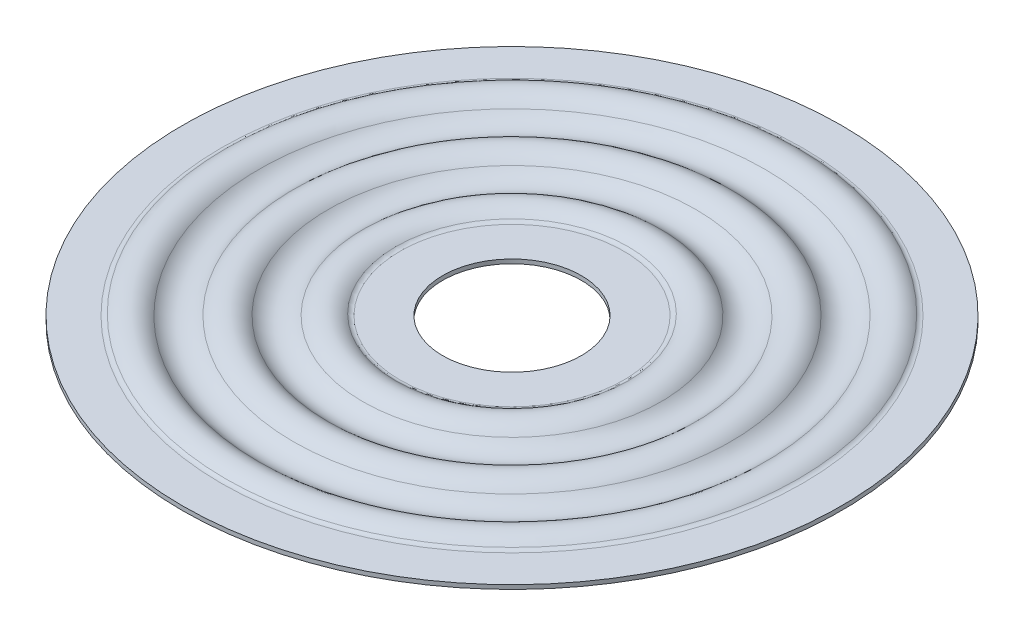
ISO-10303-21;
HEADER;
FILE_DESCRIPTION(('STEP AP214'),'2;1');
FILE_NAME('part.step','',(''),(''),'','','');
FILE_SCHEMA(('AUTOMOTIVE_DESIGN { 1 0 10303 214 1 1 1 1 }'));
ENDSEC;
DATA;
#1=APPLICATION_CONTEXT('core data for automotive mechanical design processes');
#2=APPLICATION_PROTOCOL_DEFINITION('international standard','automotive_design',2000,#1);
#3=PRODUCT_CONTEXT('',#1,'mechanical');
#4=PRODUCT('Part','Part','',(#3));
#5=PRODUCT_RELATED_PRODUCT_CATEGORY('part','',(#4));
#6=PRODUCT_DEFINITION_FORMATION('','',#4);
#7=PRODUCT_DEFINITION_CONTEXT('part definition',#1,'design');
#8=PRODUCT_DEFINITION('design','',#6,#7);
#9=PRODUCT_DEFINITION_SHAPE('','',#8);
#10=(LENGTH_UNIT() NAMED_UNIT(*) SI_UNIT(.MILLI.,.METRE.));
#11=(NAMED_UNIT(*) PLANE_ANGLE_UNIT() SI_UNIT($,.RADIAN.));
#12=(NAMED_UNIT(*) SI_UNIT($,.STERADIAN.) SOLID_ANGLE_UNIT());
#13=UNCERTAINTY_MEASURE_WITH_UNIT(LENGTH_MEASURE(1.E-05),#10,'distance_accuracy_value','');
#14=(GEOMETRIC_REPRESENTATION_CONTEXT(3) GLOBAL_UNCERTAINTY_ASSIGNED_CONTEXT((#13)) GLOBAL_UNIT_ASSIGNED_CONTEXT((#10,
#11,#12)) REPRESENTATION_CONTEXT('',''));
#15=CARTESIAN_POINT('',(0.,0.,0.));
#16=DIRECTION('',(0.,0.,1.));
#17=DIRECTION('',(1.,0.,0.));
#18=AXIS2_PLACEMENT_3D('',#15,#16,#17);
#19=CARTESIAN_POINT('',(0.,10.,0.));
#20=DIRECTION('',(0.,1.,0.));
#21=DIRECTION('',(0.,0.,1.));
#22=AXIS2_PLACEMENT_3D('',#19,#20,#21);
#23=CYLINDRICAL_SURFACE('',#22,47.5);
#24=CARTESIAN_POINT('',(0.,10.,0.));
#25=DIRECTION('',(0.,1.,0.));
#26=DIRECTION('',(0.,0.,1.));
#27=AXIS2_PLACEMENT_3D('',#24,#25,#26);
#28=CIRCLE('',#27,47.5);
#29=CARTESIAN_POINT('',(0.,10.,47.5));
#30=VERTEX_POINT('',#29);
#31=EDGE_CURVE('E54',#30,#30,#28,.T.);
#32=ORIENTED_EDGE('',*,*,#31,.F.);
#33=EDGE_LOOP('',(#32));
#34=FACE_BOUND('',#33,.T.);
#35=CARTESIAN_POINT('',(0.,9.4,0.));
#36=DIRECTION('',(0.,1.,0.));
#37=DIRECTION('',(0.,0.,1.));
#38=AXIS2_PLACEMENT_3D('',#35,#36,#37);
#39=CIRCLE('',#38,47.5);
#40=CARTESIAN_POINT('',(0.,9.4,47.5));
#41=VERTEX_POINT('',#40);
#42=EDGE_CURVE('E77',#41,#41,#39,.T.);
#43=ORIENTED_EDGE('',*,*,#42,.T.);
#44=EDGE_LOOP('',(#43));
#45=FACE_BOUND('',#44,.T.);
#46=ADVANCED_FACE('F34',(#34,#45),#23,.T.);
#47=CARTESIAN_POINT('',(-47.5,10.,0.));
#48=DIRECTION('',(0.,1.,0.));
#49=DIRECTION('',(0.,0.,1.));
#50=AXIS2_PLACEMENT_3D('',#47,#48,#49);
#51=PLANE('',#50);
#52=CARTESIAN_POINT('',(0.,10.,0.));
#53=DIRECTION('',(0.,1.,0.));
#54=DIRECTION('',(0.,0.,1.));
#55=AXIS2_PLACEMENT_3D('',#52,#53,#54);
#56=CIRCLE('',#55,41.8898132317563);
#57=CARTESIAN_POINT('',(0.,10.,41.8898132317563));
#58=VERTEX_POINT('',#57);
#59=EDGE_CURVE('E10',#58,#58,#56,.F.);
#60=ORIENTED_EDGE('',*,*,#59,.T.);
#61=EDGE_LOOP('',(#60));
#62=FACE_BOUND('',#61,.T.);
#63=ORIENTED_EDGE('',*,*,#31,.T.);
#64=EDGE_LOOP('',(#63));
#65=FACE_BOUND('',#64,.T.);
#66=ADVANCED_FACE('F114',(#62,#65),#51,.T.);
#67=CARTESIAN_POINT('',(0.,7.55051025721682,0.));
#68=DIRECTION('',(0.,1.,0.));
#69=DIRECTION('',(0.,0.,1.));
#70=AXIS2_PLACEMENT_3D('',#67,#68,#69);
#71=TOROIDAL_SURFACE('',#70,39.,3.5);
#72=CARTESIAN_POINT('',(0.,10.233446723826,0.));
#73=DIRECTION('',(0.,-1.,0.));
#74=DIRECTION('',(0.,0.,-1.));
#75=AXIS2_PLACEMENT_3D('',#72,#73,#74);
#76=CIRCLE('',#75,41.2476325135882);
#77=CARTESIAN_POINT('',(0.,10.233446723826,-41.2476325135882));
#78=VERTEX_POINT('',#77);
#79=EDGE_CURVE('E41',#78,#78,#76,.F.);
#80=ORIENTED_EDGE('',*,*,#79,.T.);
#81=EDGE_LOOP('',(#80));
#82=FACE_BOUND('',#81,.T.);
#83=CARTESIAN_POINT('',(0.,10.,0.));
#84=DIRECTION('',(0.,1.,0.));
#85=DIRECTION('',(0.,0.,1.));
#86=AXIS2_PLACEMENT_3D('',#83,#84,#85);
#87=CIRCLE('',#86,36.5);
#88=CARTESIAN_POINT('',(0.,10.,36.5));
#89=VERTEX_POINT('',#88);
#90=EDGE_CURVE('E57',#89,#89,#87,.T.);
#91=ORIENTED_EDGE('',*,*,#90,.F.);
#92=EDGE_LOOP('',(#91));
#93=FACE_BOUND('',#92,.T.);
#94=ADVANCED_FACE('F120',(#82,#93),#71,.T.);
#95=CARTESIAN_POINT('',(0.,12.4494897427832,0.));
#96=DIRECTION('',(0.,1.,0.));
#97=DIRECTION('',(0.,0.,1.));
#98=AXIS2_PLACEMENT_3D('',#95,#96,#97);
#99=TOROIDAL_SURFACE('',#98,34.,3.5);
#100=ORIENTED_EDGE('',*,*,#90,.T.);
#101=EDGE_LOOP('',(#100));
#102=FACE_BOUND('',#101,.T.);
#103=CARTESIAN_POINT('',(0.,10.,0.));
#104=DIRECTION('',(0.,1.,0.));
#105=DIRECTION('',(0.,0.,1.));
#106=AXIS2_PLACEMENT_3D('',#103,#104,#105);
#107=CIRCLE('',#106,31.5);
#108=CARTESIAN_POINT('',(0.,10.,31.5));
#109=VERTEX_POINT('',#108);
#110=EDGE_CURVE('E60',#109,#109,#107,.T.);
#111=ORIENTED_EDGE('',*,*,#110,.F.);
#112=EDGE_LOOP('',(#111));
#113=FACE_BOUND('',#112,.T.);
#114=ADVANCED_FACE('F160',(#102,#113),#99,.F.);
#115=CARTESIAN_POINT('',(0.,7.55051025721682,0.));
#116=DIRECTION('',(0.,1.,0.));
#117=DIRECTION('',(0.,0.,1.));
#118=AXIS2_PLACEMENT_3D('',#115,#116,#117);
#119=TOROIDAL_SURFACE('',#118,29.,3.5);
#120=ORIENTED_EDGE('',*,*,#110,.T.);
#121=EDGE_LOOP('',(#120));
#122=FACE_BOUND('',#121,.T.);
#123=CARTESIAN_POINT('',(0.,10.,0.));
#124=DIRECTION('',(0.,1.,0.));
#125=DIRECTION('',(0.,0.,1.));
#126=AXIS2_PLACEMENT_3D('',#123,#124,#125);
#127=CIRCLE('',#126,26.5);
#128=CARTESIAN_POINT('',(0.,10.,26.5));
#129=VERTEX_POINT('',#128);
#130=EDGE_CURVE('E63',#129,#129,#127,.T.);
#131=ORIENTED_EDGE('',*,*,#130,.F.);
#132=EDGE_LOOP('',(#131));
#133=FACE_BOUND('',#132,.T.);
#134=ADVANCED_FACE('F156',(#122,#133),#119,.T.);
#135=CARTESIAN_POINT('',(0.,12.4494897427832,0.));
#136=DIRECTION('',(0.,1.,0.));
#137=DIRECTION('',(0.,0.,1.));
#138=AXIS2_PLACEMENT_3D('',#135,#136,#137);
#139=TOROIDAL_SURFACE('',#138,24.,3.5);
#140=ORIENTED_EDGE('',*,*,#130,.T.);
#141=EDGE_LOOP('',(#140));
#142=FACE_BOUND('',#141,.T.);
#143=CARTESIAN_POINT('',(0.,10.,0.));
#144=DIRECTION('',(0.,1.,0.));
#145=DIRECTION('',(0.,0.,1.));
#146=AXIS2_PLACEMENT_3D('',#143,#144,#145);
#147=CIRCLE('',#146,21.5);
#148=CARTESIAN_POINT('',(0.,10.,21.5));
#149=VERTEX_POINT('',#148);
#150=EDGE_CURVE('E66',#149,#149,#147,.T.);
#151=ORIENTED_EDGE('',*,*,#150,.F.);
#152=EDGE_LOOP('',(#151));
#153=FACE_BOUND('',#152,.T.);
#154=ADVANCED_FACE('F149',(#142,#153),#139,.F.);
#155=CARTESIAN_POINT('',(0.,7.55051025721682,0.));
#156=DIRECTION('',(0.,1.,0.));
#157=DIRECTION('',(0.,0.,1.));
#158=AXIS2_PLACEMENT_3D('',#155,#156,#157);
#159=TOROIDAL_SURFACE('',#158,19.,3.5);
#160=CARTESIAN_POINT('',(0.,10.233446723826,0.));
#161=DIRECTION('',(0.,-1.,0.));
#162=DIRECTION('',(0.,0.,-1.));
#163=AXIS2_PLACEMENT_3D('',#160,#161,#162);
#164=CIRCLE('',#163,16.7523674864118);
#165=CARTESIAN_POINT('',(0.,10.233446723826,-16.7523674864118));
#166=VERTEX_POINT('',#165);
#167=EDGE_CURVE('E45',#166,#166,#164,.T.);
#168=ORIENTED_EDGE('',*,*,#167,.T.);
#169=EDGE_LOOP('',(#168));
#170=FACE_BOUND('',#169,.T.);
#171=ORIENTED_EDGE('',*,*,#150,.T.);
#172=EDGE_LOOP('',(#171));
#173=FACE_BOUND('',#172,.T.);
#174=ADVANCED_FACE('F142',(#170,#173),#159,.T.);
#175=CARTESIAN_POINT('',(-16.5,10.,0.));
#176=DIRECTION('',(0.,1.,0.));
#177=DIRECTION('',(0.,0.,1.));
#178=AXIS2_PLACEMENT_3D('',#175,#176,#177);
#179=PLANE('',#178);
#180=CARTESIAN_POINT('',(0.,10.,0.));
#181=DIRECTION('',(0.,1.,0.));
#182=DIRECTION('',(0.,0.,1.));
#183=AXIS2_PLACEMENT_3D('',#180,#181,#182);
#184=CIRCLE('',#183,16.1101867682437);
#185=CARTESIAN_POINT('',(0.,10.,16.1101867682437));
#186=VERTEX_POINT('',#185);
#187=EDGE_CURVE('E49',#186,#186,#184,.T.);
#188=ORIENTED_EDGE('',*,*,#187,.T.);
#189=EDGE_LOOP('',(#188));
#190=FACE_BOUND('',#189,.T.);
#191=CARTESIAN_POINT('',(0.,10.,0.));
#192=DIRECTION('',(0.,1.,0.));
#193=DIRECTION('',(0.,0.,1.));
#194=AXIS2_PLACEMENT_3D('',#191,#192,#193);
#195=CIRCLE('',#194,10.);
#196=CARTESIAN_POINT('',(0.,10.,10.));
#197=VERTEX_POINT('',#196);
#198=EDGE_CURVE('E69',#197,#197,#195,.T.);
#199=ORIENTED_EDGE('',*,*,#198,.F.);
#200=EDGE_LOOP('',(#199));
#201=FACE_BOUND('',#200,.T.);
#202=ADVANCED_FACE('F133',(#190,#201),#179,.T.);
#203=CARTESIAN_POINT('',(0.,10.,0.));
#204=DIRECTION('',(0.,1.,0.));
#205=DIRECTION('',(0.,0.,1.));
#206=AXIS2_PLACEMENT_3D('',#203,#204,#205);
#207=CYLINDRICAL_SURFACE('',#206,10.);
#208=CARTESIAN_POINT('',(0.,9.4,0.));
#209=DIRECTION('',(0.,1.,0.));
#210=DIRECTION('',(0.,0.,1.));
#211=AXIS2_PLACEMENT_3D('',#208,#209,#210);
#212=CIRCLE('',#211,10.);
#213=CARTESIAN_POINT('',(0.,9.4,10.));
#214=VERTEX_POINT('',#213);
#215=EDGE_CURVE('E73',#214,#214,#212,.T.);
#216=ORIENTED_EDGE('',*,*,#215,.F.);
#217=EDGE_LOOP('',(#216));
#218=FACE_BOUND('',#217,.T.);
#219=ORIENTED_EDGE('',*,*,#198,.T.);
#220=EDGE_LOOP('',(#219));
#221=FACE_BOUND('',#220,.T.);
#222=ADVANCED_FACE('F126',(#218,#221),#207,.F.);
#223=CARTESIAN_POINT('',(0.,11.,0.));
#224=DIRECTION('',(0.,-1.,0.));
#225=DIRECTION('',(0.,0.,-1.));
#226=AXIS2_PLACEMENT_3D('',#223,#224,#225);
#227=TOROIDAL_SURFACE('',#226,16.1101867682437,1.);
#228=ORIENTED_EDGE('',*,*,#167,.F.);
#229=EDGE_LOOP('',(#228));
#230=FACE_BOUND('',#229,.T.);
#231=ORIENTED_EDGE('',*,*,#187,.F.);
#232=EDGE_LOOP('',(#231));
#233=FACE_BOUND('',#232,.T.);
#234=ADVANCED_FACE('F124',(#230,#233),#227,.F.);
#235=CARTESIAN_POINT('',(0.,11.,0.));
#236=DIRECTION('',(0.,1.,0.));
#237=DIRECTION('',(0.,0.,1.));
#238=AXIS2_PLACEMENT_3D('',#235,#236,#237);
#239=TOROIDAL_SURFACE('',#238,41.8898132317563,1.);
#240=ORIENTED_EDGE('',*,*,#59,.F.);
#241=EDGE_LOOP('',(#240));
#242=FACE_BOUND('',#241,.T.);
#243=ORIENTED_EDGE('',*,*,#79,.F.);
#244=EDGE_LOOP('',(#243));
#245=FACE_BOUND('',#244,.T.);
#246=ADVANCED_FACE('F36',(#242,#245),#239,.F.);
#247=CARTESIAN_POINT('',(-47.5,9.4,0.));
#248=DIRECTION('',(0.,1.,0.));
#249=DIRECTION('',(0.,0.,1.));
#250=AXIS2_PLACEMENT_3D('',#247,#248,#249);
#251=PLANE('',#250);
#252=CARTESIAN_POINT('',(0.,9.4,0.));
#253=DIRECTION('',(0.,1.,0.));
#254=DIRECTION('',(0.,0.,1.));
#255=AXIS2_PLACEMENT_3D('',#252,#253,#254);
#256=CIRCLE('',#255,41.8898132317563);
#257=CARTESIAN_POINT('',(0.,9.4,41.8898132317563));
#258=VERTEX_POINT('',#257);
#259=EDGE_CURVE('E72',#258,#258,#256,.F.);
#260=ORIENTED_EDGE('',*,*,#259,.F.);
#261=EDGE_LOOP('',(#260));
#262=FACE_BOUND('',#261,.T.);
#263=ORIENTED_EDGE('',*,*,#42,.F.);
#264=EDGE_LOOP('',(#263));
#265=FACE_BOUND('',#264,.T.);
#266=ADVANCED_FACE('F106',(#262,#265),#251,.F.);
#267=CARTESIAN_POINT('',(0.,7.55051025721682,0.));
#268=DIRECTION('',(0.,1.,0.));
#269=DIRECTION('',(0.,0.,1.));
#270=AXIS2_PLACEMENT_3D('',#267,#268,#269);
#271=TOROIDAL_SURFACE('',#270,39.,2.9);
#272=CARTESIAN_POINT('',(0.,9.77351475812154,0.));
#273=DIRECTION('',(0.,1.,0.));
#274=DIRECTION('',(0.,0.,1.));
#275=AXIS2_PLACEMENT_3D('',#272,#273,#274);
#276=CIRCLE('',#275,40.8623240826874);
#277=CARTESIAN_POINT('',(0.,9.77351475812154,40.8623240826874));
#278=VERTEX_POINT('',#277);
#279=EDGE_CURVE('E87',#278,#278,#276,.T.);
#280=ORIENTED_EDGE('',*,*,#279,.F.);
#281=EDGE_LOOP('',(#280));
#282=FACE_BOUND('',#281,.T.);
#283=CARTESIAN_POINT('',(0.,9.58008747266574,0.));
#284=DIRECTION('',(0.,1.,0.));
#285=DIRECTION('',(0.,0.,1.));
#286=AXIS2_PLACEMENT_3D('',#283,#284,#285);
#287=CIRCLE('',#286,36.9285714285714);
#288=CARTESIAN_POINT('',(0.,9.58008747266574,36.9285714285714));
#289=VERTEX_POINT('',#288);
#290=EDGE_CURVE('E81',#289,#289,#287,.T.);
#291=ORIENTED_EDGE('',*,*,#290,.T.);
#292=EDGE_LOOP('',(#291));
#293=FACE_BOUND('',#292,.T.);
#294=ADVANCED_FACE('F109',(#282,#293),#271,.F.);
#295=CARTESIAN_POINT('',(0.,12.4494897427832,0.));
#296=DIRECTION('',(0.,1.,0.));
#297=DIRECTION('',(0.,0.,1.));
#298=AXIS2_PLACEMENT_3D('',#295,#296,#297);
#299=TOROIDAL_SURFACE('',#298,34.,4.1);
#300=ORIENTED_EDGE('',*,*,#290,.F.);
#301=EDGE_LOOP('',(#300));
#302=FACE_BOUND('',#301,.T.);
#303=CARTESIAN_POINT('',(0.,9.58008747266574,0.));
#304=DIRECTION('',(0.,1.,0.));
#305=DIRECTION('',(0.,0.,1.));
#306=AXIS2_PLACEMENT_3D('',#303,#304,#305);
#307=CIRCLE('',#306,31.0714285714286);
#308=CARTESIAN_POINT('',(0.,9.58008747266574,31.0714285714286));
#309=VERTEX_POINT('',#308);
#310=EDGE_CURVE('E93',#309,#309,#307,.T.);
#311=ORIENTED_EDGE('',*,*,#310,.T.);
#312=EDGE_LOOP('',(#311));
#313=FACE_BOUND('',#312,.T.);
#314=ADVANCED_FACE('F233',(#302,#313),#299,.T.);
#315=CARTESIAN_POINT('',(0.,7.55051025721682,0.));
#316=DIRECTION('',(0.,1.,0.));
#317=DIRECTION('',(0.,0.,1.));
#318=AXIS2_PLACEMENT_3D('',#315,#316,#317);
#319=TOROIDAL_SURFACE('',#318,29.,2.9);
#320=ORIENTED_EDGE('',*,*,#310,.F.);
#321=EDGE_LOOP('',(#320));
#322=FACE_BOUND('',#321,.T.);
#323=CARTESIAN_POINT('',(0.,9.58008747266574,0.));
#324=DIRECTION('',(0.,1.,0.));
#325=DIRECTION('',(0.,0.,1.));
#326=AXIS2_PLACEMENT_3D('',#323,#324,#325);
#327=CIRCLE('',#326,26.9285714285714);
#328=CARTESIAN_POINT('',(0.,9.58008747266574,26.9285714285714));
#329=VERTEX_POINT('',#328);
#330=EDGE_CURVE('E90',#329,#329,#327,.T.);
#331=ORIENTED_EDGE('',*,*,#330,.T.);
#332=EDGE_LOOP('',(#331));
#333=FACE_BOUND('',#332,.T.);
#334=ADVANCED_FACE('F243',(#322,#333),#319,.F.);
#335=CARTESIAN_POINT('',(0.,12.4494897427832,0.));
#336=DIRECTION('',(0.,1.,0.));
#337=DIRECTION('',(0.,0.,1.));
#338=AXIS2_PLACEMENT_3D('',#335,#336,#337);
#339=TOROIDAL_SURFACE('',#338,24.,4.1);
#340=ORIENTED_EDGE('',*,*,#330,.F.);
#341=EDGE_LOOP('',(#340));
#342=FACE_BOUND('',#341,.T.);
#343=CARTESIAN_POINT('',(0.,9.58008747266574,0.));
#344=DIRECTION('',(0.,1.,0.));
#345=DIRECTION('',(0.,0.,1.));
#346=AXIS2_PLACEMENT_3D('',#343,#344,#345);
#347=CIRCLE('',#346,21.0714285714286);
#348=CARTESIAN_POINT('',(0.,9.58008747266574,21.0714285714286));
#349=VERTEX_POINT('',#348);
#350=EDGE_CURVE('E76',#349,#349,#347,.T.);
#351=ORIENTED_EDGE('',*,*,#350,.T.);
#352=EDGE_LOOP('',(#351));
#353=FACE_BOUND('',#352,.T.);
#354=ADVANCED_FACE('F253',(#342,#353),#339,.T.);
#355=CARTESIAN_POINT('',(0.,7.55051025721682,0.));
#356=DIRECTION('',(0.,1.,0.));
#357=DIRECTION('',(0.,0.,1.));
#358=AXIS2_PLACEMENT_3D('',#355,#356,#357);
#359=TOROIDAL_SURFACE('',#358,19.,2.9);
#360=CARTESIAN_POINT('',(0.,9.77351475812154,0.));
#361=DIRECTION('',(0.,1.,0.));
#362=DIRECTION('',(0.,0.,1.));
#363=AXIS2_PLACEMENT_3D('',#360,#361,#362);
#364=CIRCLE('',#363,17.1376759173126);
#365=CARTESIAN_POINT('',(0.,9.77351475812154,17.1376759173126));
#366=VERTEX_POINT('',#365);
#367=EDGE_CURVE('E84',#366,#366,#364,.F.);
#368=ORIENTED_EDGE('',*,*,#367,.F.);
#369=EDGE_LOOP('',(#368));
#370=FACE_BOUND('',#369,.T.);
#371=ORIENTED_EDGE('',*,*,#350,.F.);
#372=EDGE_LOOP('',(#371));
#373=FACE_BOUND('',#372,.T.);
#374=ADVANCED_FACE('F263',(#370,#373),#359,.F.);
#375=CARTESIAN_POINT('',(-16.5,9.4,0.));
#376=DIRECTION('',(0.,1.,0.));
#377=DIRECTION('',(0.,0.,1.));
#378=AXIS2_PLACEMENT_3D('',#375,#376,#377);
#379=PLANE('',#378);
#380=CARTESIAN_POINT('',(0.,9.4,0.));
#381=DIRECTION('',(0.,-1.,0.));
#382=DIRECTION('',(0.,0.,-1.));
#383=AXIS2_PLACEMENT_3D('',#380,#381,#382);
#384=CIRCLE('',#383,16.1101867682437);
#385=CARTESIAN_POINT('',(0.,9.4,-16.1101867682437));
#386=VERTEX_POINT('',#385);
#387=EDGE_CURVE('E80',#386,#386,#384,.F.);
#388=ORIENTED_EDGE('',*,*,#387,.F.);
#389=EDGE_LOOP('',(#388));
#390=FACE_BOUND('',#389,.T.);
#391=ORIENTED_EDGE('',*,*,#215,.T.);
#392=EDGE_LOOP('',(#391));
#393=FACE_BOUND('',#392,.T.);
#394=ADVANCED_FACE('F273',(#390,#393),#379,.F.);
#395=CARTESIAN_POINT('',(0.,11.,0.));
#396=DIRECTION('',(0.,-1.,0.));
#397=DIRECTION('',(0.,0.,-1.));
#398=AXIS2_PLACEMENT_3D('',#395,#396,#397);
#399=TOROIDAL_SURFACE('',#398,16.1101867682437,1.6);
#400=ORIENTED_EDGE('',*,*,#367,.T.);
#401=EDGE_LOOP('',(#400));
#402=FACE_BOUND('',#401,.T.);
#403=ORIENTED_EDGE('',*,*,#387,.T.);
#404=EDGE_LOOP('',(#403));
#405=FACE_BOUND('',#404,.T.);
#406=ADVANCED_FACE('F283',(#402,#405),#399,.T.);
#407=CARTESIAN_POINT('',(0.,11.,0.));
#408=DIRECTION('',(0.,1.,0.));
#409=DIRECTION('',(0.,0.,1.));
#410=AXIS2_PLACEMENT_3D('',#407,#408,#409);
#411=TOROIDAL_SURFACE('',#410,41.8898132317563,1.6);
#412=ORIENTED_EDGE('',*,*,#259,.T.);
#413=EDGE_LOOP('',(#412));
#414=FACE_BOUND('',#413,.T.);
#415=ORIENTED_EDGE('',*,*,#279,.T.);
#416=EDGE_LOOP('',(#415));
#417=FACE_BOUND('',#416,.T.);
#418=ADVANCED_FACE('F103',(#414,#417),#411,.T.);
#419=CLOSED_SHELL('',(#46,#66,#94,#114,#134,#154,#174,#202,#222,#234,#246,#266,#294,#314,#334,
#354,#374,#394,#406,#418));
#420=MANIFOLD_SOLID_BREP('B2',#419);
#421=ADVANCED_BREP_SHAPE_REPRESENTATION('',(#18,#420),#14);
#422=SHAPE_DEFINITION_REPRESENTATION(#9,#421);
ENDSEC;
END-ISO-10303-21;
